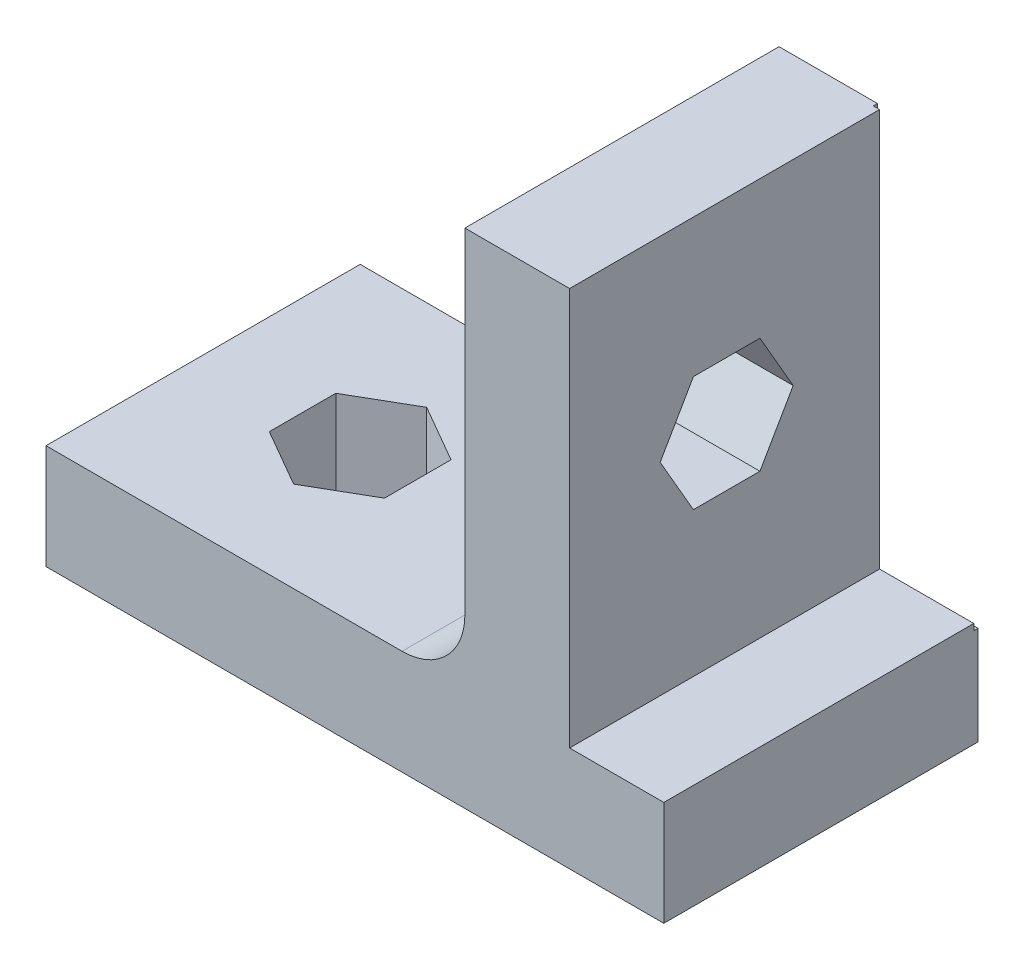
ISO-10303-21;
HEADER;
FILE_DESCRIPTION(('STEP AP214'),'2;1');
FILE_NAME('part.step','',(''),(''),'','','');
FILE_SCHEMA(('AUTOMOTIVE_DESIGN { 1 0 10303 214 1 1 1 1 }'));
ENDSEC;
DATA;
#1=APPLICATION_CONTEXT('core data for automotive mechanical design processes');
#2=APPLICATION_PROTOCOL_DEFINITION('international standard','automotive_design',2000,#1);
#3=PRODUCT_CONTEXT('',#1,'mechanical');
#4=PRODUCT('Part','Part','',(#3));
#5=PRODUCT_RELATED_PRODUCT_CATEGORY('part','',(#4));
#6=PRODUCT_DEFINITION_FORMATION('','',#4);
#7=PRODUCT_DEFINITION_CONTEXT('part definition',#1,'design');
#8=PRODUCT_DEFINITION('design','',#6,#7);
#9=PRODUCT_DEFINITION_SHAPE('','',#8);
#10=(LENGTH_UNIT() NAMED_UNIT(*) SI_UNIT(.MILLI.,.METRE.));
#11=(NAMED_UNIT(*) PLANE_ANGLE_UNIT() SI_UNIT($,.RADIAN.));
#12=(NAMED_UNIT(*) SI_UNIT($,.STERADIAN.) SOLID_ANGLE_UNIT());
#13=UNCERTAINTY_MEASURE_WITH_UNIT(LENGTH_MEASURE(1.E-05),#10,'distance_accuracy_value','');
#14=(GEOMETRIC_REPRESENTATION_CONTEXT(3) GLOBAL_UNCERTAINTY_ASSIGNED_CONTEXT((#13)) GLOBAL_UNIT_ASSIGNED_CONTEXT((#10,
#11,#12)) REPRESENTATION_CONTEXT('',''));
#15=CARTESIAN_POINT('',(0.,0.,0.));
#16=DIRECTION('',(0.,0.,1.));
#17=DIRECTION('',(1.,0.,0.));
#18=AXIS2_PLACEMENT_3D('',#15,#16,#17);
#19=CARTESIAN_POINT('',(29.5,0.,15.));
#20=DIRECTION('',(-1.,0.,0.));
#21=DIRECTION('',(0.,0.,1.));
#22=AXIS2_PLACEMENT_3D('',#19,#20,#21);
#23=PLANE('',#22);
#24=DIRECTION('',(0.,-1.,0.));
#25=VECTOR('',#24,1.);
#26=CARTESIAN_POINT('',(29.5,0.,0.2));
#27=LINE('',#26,#25);
#28=CARTESIAN_POINT('',(29.5,5.,0.2));
#29=VERTEX_POINT('',#28);
#30=CARTESIAN_POINT('',(29.5,4.7,0.2));
#31=VERTEX_POINT('',#30);
#32=EDGE_CURVE('E242',#29,#31,#27,.T.);
#33=ORIENTED_EDGE('',*,*,#32,.F.);
#34=DIRECTION('',(0.,0.,-1.));
#35=VECTOR('',#34,1.);
#36=CARTESIAN_POINT('',(29.5,5.,15.));
#37=LINE('',#36,#35);
#38=CARTESIAN_POINT('',(29.5,5.,15.));
#39=VERTEX_POINT('',#38);
#40=EDGE_CURVE('E428',#39,#29,#37,.T.);
#41=ORIENTED_EDGE('',*,*,#40,.F.);
#42=DIRECTION('',(0.,1.,0.));
#43=VECTOR('',#42,1.);
#44=CARTESIAN_POINT('',(29.5,0.,15.));
#45=LINE('',#44,#43);
#46=CARTESIAN_POINT('',(29.5,0.,15.));
#47=VERTEX_POINT('',#46);
#48=EDGE_CURVE('E376',#47,#39,#45,.T.);
#49=ORIENTED_EDGE('',*,*,#48,.F.);
#50=DIRECTION('',(0.,0.,-1.));
#51=VECTOR('',#50,1.);
#52=CARTESIAN_POINT('',(29.5,0.,15.));
#53=LINE('',#52,#51);
#54=CARTESIAN_POINT('',(29.5,0.,0.));
#55=VERTEX_POINT('',#54);
#56=EDGE_CURVE('E427',#47,#55,#53,.T.);
#57=ORIENTED_EDGE('',*,*,#56,.T.);
#58=DIRECTION('',(0.,1.,0.));
#59=VECTOR('',#58,1.);
#60=CARTESIAN_POINT('',(29.5,0.,0.));
#61=LINE('',#60,#59);
#62=CARTESIAN_POINT('',(29.5,4.7,0.));
#63=VERTEX_POINT('',#62);
#64=EDGE_CURVE('E402',#55,#63,#61,.T.);
#65=ORIENTED_EDGE('',*,*,#64,.T.);
#66=DIRECTION('',(0.,0.,-1.));
#67=VECTOR('',#66,1.);
#68=CARTESIAN_POINT('',(29.5,4.7,0.2));
#69=LINE('',#68,#67);
#70=EDGE_CURVE('E220',#31,#63,#69,.T.);
#71=ORIENTED_EDGE('',*,*,#70,.F.);
#72=EDGE_LOOP('',(#33,#41,#49,#57,#65,#71));
#73=FACE_BOUND('',#72,.T.);
#74=ADVANCED_FACE('F44',(#73),#23,.F.);
#75=CARTESIAN_POINT('',(29.5,5.,15.));
#76=DIRECTION('',(0.,-1.,0.));
#77=DIRECTION('',(0.,0.,-1.));
#78=AXIS2_PLACEMENT_3D('',#75,#76,#77);
#79=PLANE('',#78);
#80=DIRECTION('',(1.,0.,0.));
#81=VECTOR('',#80,1.);
#82=CARTESIAN_POINT('',(0.,5.,0.2));
#83=LINE('',#82,#81);
#84=CARTESIAN_POINT('',(25.,5.,0.2));
#85=VERTEX_POINT('',#84);
#86=EDGE_CURVE('E237',#85,#29,#83,.T.);
#87=ORIENTED_EDGE('',*,*,#86,.F.);
#88=DIRECTION('',(0.,0.,-1.));
#89=VECTOR('',#88,1.);
#90=CARTESIAN_POINT('',(25.,5.,15.));
#91=LINE('',#90,#89);
#92=CARTESIAN_POINT('',(25.,5.,15.));
#93=VERTEX_POINT('',#92);
#94=EDGE_CURVE('E422',#93,#85,#91,.T.);
#95=ORIENTED_EDGE('',*,*,#94,.F.);
#96=DIRECTION('',(-1.,0.,0.));
#97=VECTOR('',#96,1.);
#98=CARTESIAN_POINT('',(29.5,5.,15.));
#99=LINE('',#98,#97);
#100=EDGE_CURVE('E378',#39,#93,#99,.T.);
#101=ORIENTED_EDGE('',*,*,#100,.F.);
#102=ORIENTED_EDGE('',*,*,#40,.T.);
#103=EDGE_LOOP('',(#87,#95,#101,#102));
#104=FACE_BOUND('',#103,.T.);
#105=ADVANCED_FACE('F491',(#104),#79,.F.);
#106=CARTESIAN_POINT('',(25.,5.,15.));
#107=DIRECTION('',(-1.,0.,0.));
#108=DIRECTION('',(0.,-1.,0.));
#109=AXIS2_PLACEMENT_3D('',#106,#107,#108);
#110=PLANE('',#109);
#111=DIRECTION('',(0.,0.866025403784439,-0.5));
#112=VECTOR('',#111,1.);
#113=CARTESIAN_POINT('',(25.,11.9,5.91228675972853));
#114=LINE('',#113,#112);
#115=CARTESIAN_POINT('',(25.,11.9,5.91228675972853));
#116=VERTEX_POINT('',#115);
#117=CARTESIAN_POINT('',(25.,14.65,4.32457351945706));
#118=VERTEX_POINT('',#117);
#119=EDGE_CURVE('E264',#116,#118,#114,.T.);
#120=ORIENTED_EDGE('',*,*,#119,.F.);
#121=DIRECTION('',(0.,0.,-1.));
#122=VECTOR('',#121,1.);
#123=CARTESIAN_POINT('',(25.,11.9,9.08771324027147));
#124=LINE('',#123,#122);
#125=CARTESIAN_POINT('',(25.,11.9,9.08771324027147));
#126=VERTEX_POINT('',#125);
#127=EDGE_CURVE('E256',#126,#116,#124,.T.);
#128=ORIENTED_EDGE('',*,*,#127,.F.);
#129=DIRECTION('',(0.,-0.866025403784439,-0.5));
#130=VECTOR('',#129,1.);
#131=CARTESIAN_POINT('',(25.,14.65,10.6754264805429));
#132=LINE('',#131,#130);
#133=CARTESIAN_POINT('',(25.,14.65,10.6754264805429));
#134=VERTEX_POINT('',#133);
#135=EDGE_CURVE('E280',#134,#126,#132,.T.);
#136=ORIENTED_EDGE('',*,*,#135,.F.);
#137=DIRECTION('',(0.,-0.866025403784438,0.5));
#138=VECTOR('',#137,1.);
#139=CARTESIAN_POINT('',(25.,17.4,9.08771324027148));
#140=LINE('',#139,#138);
#141=CARTESIAN_POINT('',(25.,17.4,9.08771324027148));
#142=VERTEX_POINT('',#141);
#143=EDGE_CURVE('E274',#142,#134,#140,.T.);
#144=ORIENTED_EDGE('',*,*,#143,.F.);
#145=DIRECTION('',(0.,0.,1.));
#146=VECTOR('',#145,1.);
#147=CARTESIAN_POINT('',(25.,17.4,5.91228675972854));
#148=LINE('',#147,#146);
#149=CARTESIAN_POINT('',(25.,17.4,5.91228675972854));
#150=VERTEX_POINT('',#149);
#151=EDGE_CURVE('E266',#150,#142,#148,.T.);
#152=ORIENTED_EDGE('',*,*,#151,.F.);
#153=DIRECTION('',(0.,0.866025403784438,0.5));
#154=VECTOR('',#153,1.);
#155=CARTESIAN_POINT('',(25.,14.65,4.32457351945706));
#156=LINE('',#155,#154);
#157=EDGE_CURVE('E268',#118,#150,#156,.T.);
#158=ORIENTED_EDGE('',*,*,#157,.F.);
#159=EDGE_LOOP('',(#120,#128,#136,#144,#152,#158));
#160=FACE_BOUND('',#159,.T.);
#161=DIRECTION('',(0.,-1.,0.));
#162=VECTOR('',#161,1.);
#163=CARTESIAN_POINT('',(25.,0.,0.2));
#164=LINE('',#163,#162);
#165=CARTESIAN_POINT('',(25.,24.,0.200000000000001));
#166=VERTEX_POINT('',#165);
#167=EDGE_CURVE('E236',#166,#85,#164,.T.);
#168=ORIENTED_EDGE('',*,*,#167,.F.);
#169=DIRECTION('',(0.,0.,-1.));
#170=VECTOR('',#169,1.);
#171=CARTESIAN_POINT('',(25.,24.,15.));
#172=LINE('',#171,#170);
#173=CARTESIAN_POINT('',(25.,24.,15.));
#174=VERTEX_POINT('',#173);
#175=EDGE_CURVE('E234',#174,#166,#172,.T.);
#176=ORIENTED_EDGE('',*,*,#175,.F.);
#177=DIRECTION('',(0.,1.,0.));
#178=VECTOR('',#177,1.);
#179=CARTESIAN_POINT('',(25.,5.,15.));
#180=LINE('',#179,#178);
#181=EDGE_CURVE('E385',#93,#174,#180,.T.);
#182=ORIENTED_EDGE('',*,*,#181,.F.);
#183=ORIENTED_EDGE('',*,*,#94,.T.);
#184=EDGE_LOOP('',(#168,#176,#182,#183));
#185=FACE_BOUND('',#184,.T.);
#186=ADVANCED_FACE('F499',(#160,#185),#110,.F.);
#187=CARTESIAN_POINT('',(0.,5.,15.));
#188=DIRECTION('',(1.,0.,0.));
#189=DIRECTION('',(0.,1.,0.));
#190=AXIS2_PLACEMENT_3D('',#187,#188,#189);
#191=PLANE('',#190);
#192=DIRECTION('',(0.,-1.,0.));
#193=VECTOR('',#192,1.);
#194=CARTESIAN_POINT('',(0.,5.,0.));
#195=LINE('',#194,#193);
#196=CARTESIAN_POINT('',(0.,5.,0.));
#197=VERTEX_POINT('',#196);
#198=CARTESIAN_POINT('',(0.,0.,0.));
#199=VERTEX_POINT('',#198);
#200=EDGE_CURVE('E354',#197,#199,#195,.T.);
#201=ORIENTED_EDGE('',*,*,#200,.T.);
#202=DIRECTION('',(0.,0.,-1.));
#203=VECTOR('',#202,1.);
#204=CARTESIAN_POINT('',(0.,0.,15.));
#205=LINE('',#204,#203);
#206=CARTESIAN_POINT('',(0.,0.,15.));
#207=VERTEX_POINT('',#206);
#208=EDGE_CURVE('E432',#207,#199,#205,.T.);
#209=ORIENTED_EDGE('',*,*,#208,.F.);
#210=DIRECTION('',(0.,-1.,0.));
#211=VECTOR('',#210,1.);
#212=CARTESIAN_POINT('',(0.,5.,15.));
#213=LINE('',#212,#211);
#214=CARTESIAN_POINT('',(0.,5.,15.));
#215=VERTEX_POINT('',#214);
#216=EDGE_CURVE('E368',#215,#207,#213,.T.);
#217=ORIENTED_EDGE('',*,*,#216,.F.);
#218=DIRECTION('',(0.,0.,-1.));
#219=VECTOR('',#218,1.);
#220=CARTESIAN_POINT('',(0.,5.,15.));
#221=LINE('',#220,#219);
#222=EDGE_CURVE('E395',#215,#197,#221,.T.);
#223=ORIENTED_EDGE('',*,*,#222,.T.);
#224=EDGE_LOOP('',(#201,#209,#217,#223));
#225=FACE_BOUND('',#224,.T.);
#226=ADVANCED_FACE('F476',(#225),#191,.F.);
#227=CARTESIAN_POINT('',(0.,0.,15.));
#228=DIRECTION('',(0.,1.,0.));
#229=DIRECTION('',(0.,0.,1.));
#230=AXIS2_PLACEMENT_3D('',#227,#228,#229);
#231=PLANE('',#230);
#232=DIRECTION('',(0.866025403784439,0.,-0.5));
#233=VECTOR('',#232,1.);
#234=CARTESIAN_POINT('',(7.5,0.,10.6754264805429));
#235=LINE('',#234,#233);
#236=CARTESIAN_POINT('',(7.5,0.,10.6754264805429));
#237=VERTEX_POINT('',#236);
#238=CARTESIAN_POINT('',(10.25,0.,9.08771324027147));
#239=VERTEX_POINT('',#238);
#240=EDGE_CURVE('E325',#237,#239,#235,.T.);
#241=ORIENTED_EDGE('',*,*,#240,.T.);
#242=DIRECTION('',(0.,0.,-1.));
#243=VECTOR('',#242,1.);
#244=CARTESIAN_POINT('',(10.25,0.,9.08771324027147));
#245=LINE('',#244,#243);
#246=CARTESIAN_POINT('',(10.25,0.,5.91228675972853));
#247=VERTEX_POINT('',#246);
#248=EDGE_CURVE('E305',#239,#247,#245,.T.);
#249=ORIENTED_EDGE('',*,*,#248,.T.);
#250=DIRECTION('',(-0.866025403784439,0.,-0.5));
#251=VECTOR('',#250,1.);
#252=CARTESIAN_POINT('',(10.25,0.,5.91228675972853));
#253=LINE('',#252,#251);
#254=CARTESIAN_POINT('',(7.5,0.,4.32457351945706));
#255=VERTEX_POINT('',#254);
#256=EDGE_CURVE('E306',#247,#255,#253,.T.);
#257=ORIENTED_EDGE('',*,*,#256,.T.);
#258=DIRECTION('',(-0.866025403784439,0.,0.5));
#259=VECTOR('',#258,1.);
#260=CARTESIAN_POINT('',(7.5,0.,4.32457351945706));
#261=LINE('',#260,#259);
#262=CARTESIAN_POINT('',(4.75,0.,5.91228675972853));
#263=VERTEX_POINT('',#262);
#264=EDGE_CURVE('E311',#255,#263,#261,.T.);
#265=ORIENTED_EDGE('',*,*,#264,.T.);
#266=DIRECTION('',(0.,0.,1.));
#267=VECTOR('',#266,1.);
#268=CARTESIAN_POINT('',(4.75,0.,5.91228675972853));
#269=LINE('',#268,#267);
#270=CARTESIAN_POINT('',(4.75,0.,9.08771324027147));
#271=VERTEX_POINT('',#270);
#272=EDGE_CURVE('E314',#263,#271,#269,.T.);
#273=ORIENTED_EDGE('',*,*,#272,.T.);
#274=DIRECTION('',(0.866025403784438,0.,0.5));
#275=VECTOR('',#274,1.);
#276=CARTESIAN_POINT('',(4.75,0.,9.08771324027147));
#277=LINE('',#276,#275);
#278=EDGE_CURVE('E316',#271,#237,#277,.T.);
#279=ORIENTED_EDGE('',*,*,#278,.T.);
#280=EDGE_LOOP('',(#241,#249,#257,#265,#273,#279));
#281=FACE_BOUND('',#280,.T.);
#282=DIRECTION('',(1.,0.,0.));
#283=VECTOR('',#282,1.);
#284=CARTESIAN_POINT('',(0.,0.,0.));
#285=LINE('',#284,#283);
#286=EDGE_CURVE('E397',#199,#55,#285,.T.);
#287=ORIENTED_EDGE('',*,*,#286,.T.);
#288=ORIENTED_EDGE('',*,*,#56,.F.);
#289=DIRECTION('',(1.,0.,0.));
#290=VECTOR('',#289,1.);
#291=CARTESIAN_POINT('',(0.,0.,15.));
#292=LINE('',#291,#290);
#293=EDGE_CURVE('E375',#207,#47,#292,.T.);
#294=ORIENTED_EDGE('',*,*,#293,.F.);
#295=ORIENTED_EDGE('',*,*,#208,.T.);
#296=EDGE_LOOP('',(#287,#288,#294,#295));
#297=FACE_BOUND('',#296,.T.);
#298=ADVANCED_FACE('F506',(#281,#297),#231,.F.);
#299=CARTESIAN_POINT('',(25.,24.,15.));
#300=DIRECTION('',(0.,-1.,0.));
#301=DIRECTION('',(0.,0.,-1.));
#302=AXIS2_PLACEMENT_3D('',#299,#300,#301);
#303=PLANE('',#302);
#304=DIRECTION('',(1.,0.,0.));
#305=VECTOR('',#304,1.);
#306=CARTESIAN_POINT('',(0.,24.,0.2));
#307=LINE('',#306,#305);
#308=CARTESIAN_POINT('',(24.7,24.,0.2));
#309=VERTEX_POINT('',#308);
#310=EDGE_CURVE('E225',#309,#166,#307,.T.);
#311=ORIENTED_EDGE('',*,*,#310,.F.);
#312=DIRECTION('',(0.,0.,-1.));
#313=VECTOR('',#312,1.);
#314=CARTESIAN_POINT('',(24.7,24.,0.2));
#315=LINE('',#314,#313);
#316=CARTESIAN_POINT('',(24.7,24.,0.));
#317=VERTEX_POINT('',#316);
#318=EDGE_CURVE('E210',#309,#317,#315,.T.);
#319=ORIENTED_EDGE('',*,*,#318,.T.);
#320=DIRECTION('',(-1.,0.,0.));
#321=VECTOR('',#320,1.);
#322=CARTESIAN_POINT('',(25.,24.,0.));
#323=LINE('',#322,#321);
#324=CARTESIAN_POINT('',(20.,24.,0.));
#325=VERTEX_POINT('',#324);
#326=EDGE_CURVE('E403',#317,#325,#323,.T.);
#327=ORIENTED_EDGE('',*,*,#326,.T.);
#328=DIRECTION('',(0.,0.,-1.));
#329=VECTOR('',#328,1.);
#330=CARTESIAN_POINT('',(20.,24.,15.));
#331=LINE('',#330,#329);
#332=CARTESIAN_POINT('',(20.,24.,15.));
#333=VERTEX_POINT('',#332);
#334=EDGE_CURVE('E418',#333,#325,#331,.T.);
#335=ORIENTED_EDGE('',*,*,#334,.F.);
#336=DIRECTION('',(-1.,0.,0.));
#337=VECTOR('',#336,1.);
#338=CARTESIAN_POINT('',(25.,24.,15.));
#339=LINE('',#338,#337);
#340=EDGE_CURVE('E383',#174,#333,#339,.T.);
#341=ORIENTED_EDGE('',*,*,#340,.F.);
#342=ORIENTED_EDGE('',*,*,#175,.T.);
#343=EDGE_LOOP('',(#311,#319,#327,#335,#341,#342));
#344=FACE_BOUND('',#343,.T.);
#345=ADVANCED_FACE('F233',(#344),#303,.F.);
#346=CARTESIAN_POINT('',(20.,24.,15.));
#347=DIRECTION('',(1.,0.,0.));
#348=DIRECTION('',(0.,1.,0.));
#349=AXIS2_PLACEMENT_3D('',#346,#347,#348);
#350=PLANE('',#349);
#351=DIRECTION('',(0.,-0.866025403784439,-0.5));
#352=VECTOR('',#351,1.);
#353=CARTESIAN_POINT('',(20.,23.5350952641916,15.8052386230995));
#354=LINE('',#353,#352);
#355=CARTESIAN_POINT('',(20.,14.65,10.6754264805429));
#356=VERTEX_POINT('',#355);
#357=CARTESIAN_POINT('',(20.,11.9,9.08771324027147));
#358=VERTEX_POINT('',#357);
#359=EDGE_CURVE('E453',#356,#358,#354,.T.);
#360=ORIENTED_EDGE('',*,*,#359,.T.);
#361=DIRECTION('',(0.,0.,-1.));
#362=VECTOR('',#361,1.);
#363=CARTESIAN_POINT('',(20.,11.9,15.));
#364=LINE('',#363,#362);
#365=CARTESIAN_POINT('',(20.,11.9,5.91228675972853));
#366=VERTEX_POINT('',#365);
#367=EDGE_CURVE('E457',#358,#366,#364,.T.);
#368=ORIENTED_EDGE('',*,*,#367,.T.);
#369=DIRECTION('',(0.,0.866025403784439,-0.5));
#370=VECTOR('',#369,1.);
#371=CARTESIAN_POINT('',(20.,17.0399047358084,2.94476137690054));
#372=LINE('',#371,#370);
#373=CARTESIAN_POINT('',(20.,14.65,4.32457351945706));
#374=VERTEX_POINT('',#373);
#375=EDGE_CURVE('E438',#366,#374,#372,.T.);
#376=ORIENTED_EDGE('',*,*,#375,.T.);
#377=DIRECTION('',(0.,0.866025403784439,0.5));
#378=VECTOR('',#377,1.);
#379=CARTESIAN_POINT('',(20.,26.2850952641916,11.042098902285));
#380=LINE('',#379,#378);
#381=CARTESIAN_POINT('',(20.,17.4,5.91228675972854));
#382=VERTEX_POINT('',#381);
#383=EDGE_CURVE('E445',#374,#382,#380,.T.);
#384=ORIENTED_EDGE('',*,*,#383,.T.);
#385=DIRECTION('',(0.,0.,1.));
#386=VECTOR('',#385,1.);
#387=CARTESIAN_POINT('',(20.,17.4,15.));
#388=LINE('',#387,#386);
#389=CARTESIAN_POINT('',(20.,17.4,9.08771324027148));
#390=VERTEX_POINT('',#389);
#391=EDGE_CURVE('E447',#382,#390,#388,.T.);
#392=ORIENTED_EDGE('',*,*,#391,.T.);
#393=DIRECTION('',(0.,-0.866025403784439,0.5));
#394=VECTOR('',#393,1.);
#395=CARTESIAN_POINT('',(20.,19.7899047358084,7.70790109771496));
#396=LINE('',#395,#394);
#397=EDGE_CURVE('E448',#390,#356,#396,.T.);
#398=ORIENTED_EDGE('',*,*,#397,.T.);
#399=EDGE_LOOP('',(#360,#368,#376,#384,#392,#398));
#400=FACE_BOUND('',#399,.T.);
#401=DIRECTION('',(0.,-1.,0.));
#402=VECTOR('',#401,1.);
#403=CARTESIAN_POINT('',(20.,24.,0.));
#404=LINE('',#403,#402);
#405=CARTESIAN_POINT('',(20.,8.,0.));
#406=VERTEX_POINT('',#405);
#407=EDGE_CURVE('E410',#325,#406,#404,.T.);
#408=ORIENTED_EDGE('',*,*,#407,.T.);
#409=DIRECTION('',(0.,0.,-1.));
#410=VECTOR('',#409,1.);
#411=CARTESIAN_POINT('',(20.,8.,15.));
#412=LINE('',#411,#410);
#413=CARTESIAN_POINT('',(20.,8.,15.));
#414=VERTEX_POINT('',#413);
#415=EDGE_CURVE('E64',#406,#414,#412,.F.);
#416=ORIENTED_EDGE('',*,*,#415,.T.);
#417=DIRECTION('',(0.,-1.,0.));
#418=VECTOR('',#417,1.);
#419=CARTESIAN_POINT('',(20.,24.,15.));
#420=LINE('',#419,#418);
#421=EDGE_CURVE('E390',#333,#414,#420,.T.);
#422=ORIENTED_EDGE('',*,*,#421,.F.);
#423=ORIENTED_EDGE('',*,*,#334,.T.);
#424=EDGE_LOOP('',(#408,#416,#422,#423));
#425=FACE_BOUND('',#424,.T.);
#426=ADVANCED_FACE('F523',(#400,#425),#350,.F.);
#427=CARTESIAN_POINT('',(20.,5.,15.));
#428=DIRECTION('',(0.,-1.,0.));
#429=DIRECTION('',(1.,0.,0.));
#430=AXIS2_PLACEMENT_3D('',#427,#428,#429);
#431=PLANE('',#430);
#432=DIRECTION('',(-0.866025403784439,0.,-0.5));
#433=VECTOR('',#432,1.);
#434=CARTESIAN_POINT('',(10.25,5.,5.91228675972853));
#435=LINE('',#434,#433);
#436=CARTESIAN_POINT('',(10.25,5.,5.91228675972853));
#437=VERTEX_POINT('',#436);
#438=CARTESIAN_POINT('',(7.5,5.,4.32457351945706));
#439=VERTEX_POINT('',#438);
#440=EDGE_CURVE('E326',#437,#439,#435,.T.);
#441=ORIENTED_EDGE('',*,*,#440,.F.);
#442=DIRECTION('',(0.,0.,-1.));
#443=VECTOR('',#442,1.);
#444=CARTESIAN_POINT('',(10.25,5.,9.08771324027147));
#445=LINE('',#444,#443);
#446=CARTESIAN_POINT('',(10.25,5.,9.08771324027147));
#447=VERTEX_POINT('',#446);
#448=EDGE_CURVE('E288',#447,#437,#445,.T.);
#449=ORIENTED_EDGE('',*,*,#448,.F.);
#450=DIRECTION('',(0.866025403784439,0.,-0.5));
#451=VECTOR('',#450,1.);
#452=CARTESIAN_POINT('',(7.5,5.,10.6754264805429));
#453=LINE('',#452,#451);
#454=CARTESIAN_POINT('',(7.5,5.,10.6754264805429));
#455=VERTEX_POINT('',#454);
#456=EDGE_CURVE('E310',#455,#447,#453,.T.);
#457=ORIENTED_EDGE('',*,*,#456,.F.);
#458=DIRECTION('',(0.866025403784438,0.,0.5));
#459=VECTOR('',#458,1.);
#460=CARTESIAN_POINT('',(4.75,5.,9.08771324027147));
#461=LINE('',#460,#459);
#462=CARTESIAN_POINT('',(4.75,5.,9.08771324027147));
#463=VERTEX_POINT('',#462);
#464=EDGE_CURVE('E341',#463,#455,#461,.T.);
#465=ORIENTED_EDGE('',*,*,#464,.F.);
#466=DIRECTION('',(0.,0.,1.));
#467=VECTOR('',#466,1.);
#468=CARTESIAN_POINT('',(4.75,5.,5.91228675972853));
#469=LINE('',#468,#467);
#470=CARTESIAN_POINT('',(4.75,5.,5.91228675972853));
#471=VERTEX_POINT('',#470);
#472=EDGE_CURVE('E336',#471,#463,#469,.T.);
#473=ORIENTED_EDGE('',*,*,#472,.F.);
#474=DIRECTION('',(-0.866025403784439,0.,0.5));
#475=VECTOR('',#474,1.);
#476=CARTESIAN_POINT('',(7.5,5.,4.32457351945706));
#477=LINE('',#476,#475);
#478=EDGE_CURVE('E335',#439,#471,#477,.T.);
#479=ORIENTED_EDGE('',*,*,#478,.F.);
#480=EDGE_LOOP('',(#441,#449,#457,#465,#473,#479));
#481=FACE_BOUND('',#480,.T.);
#482=DIRECTION('',(-1.,0.,0.));
#483=VECTOR('',#482,1.);
#484=CARTESIAN_POINT('',(20.,5.,15.));
#485=LINE('',#484,#483);
#486=CARTESIAN_POINT('',(17.,5.,15.));
#487=VERTEX_POINT('',#486);
#488=EDGE_CURVE('E393',#487,#215,#485,.T.);
#489=ORIENTED_EDGE('',*,*,#488,.F.);
#490=DIRECTION('',(0.,0.,-1.));
#491=VECTOR('',#490,1.);
#492=CARTESIAN_POINT('',(17.,5.,0.));
#493=LINE('',#492,#491);
#494=CARTESIAN_POINT('',(17.,5.,0.));
#495=VERTEX_POINT('',#494);
#496=EDGE_CURVE('E464',#487,#495,#493,.T.);
#497=ORIENTED_EDGE('',*,*,#496,.T.);
#498=DIRECTION('',(-1.,0.,0.));
#499=VECTOR('',#498,1.);
#500=CARTESIAN_POINT('',(20.,5.,0.));
#501=LINE('',#500,#499);
#502=EDGE_CURVE('E373',#495,#197,#501,.T.);
#503=ORIENTED_EDGE('',*,*,#502,.T.);
#504=ORIENTED_EDGE('',*,*,#222,.F.);
#505=EDGE_LOOP('',(#489,#497,#503,#504));
#506=FACE_BOUND('',#505,.T.);
#507=ADVANCED_FACE('F474',(#481,#506),#431,.F.);
#508=CARTESIAN_POINT('',(0.,0.,15.));
#509=DIRECTION('',(0.,0.,1.));
#510=DIRECTION('',(1.,0.,0.));
#511=AXIS2_PLACEMENT_3D('',#508,#509,#510);
#512=PLANE('',#511);
#513=ORIENTED_EDGE('',*,*,#216,.T.);
#514=ORIENTED_EDGE('',*,*,#293,.T.);
#515=ORIENTED_EDGE('',*,*,#48,.T.);
#516=ORIENTED_EDGE('',*,*,#100,.T.);
#517=ORIENTED_EDGE('',*,*,#181,.T.);
#518=ORIENTED_EDGE('',*,*,#340,.T.);
#519=ORIENTED_EDGE('',*,*,#421,.T.);
#520=CARTESIAN_POINT('',(17.,8.,15.));
#521=DIRECTION('',(0.,0.,1.));
#522=DIRECTION('',(1.,0.,0.));
#523=AXIS2_PLACEMENT_3D('',#520,#521,#522);
#524=CIRCLE('',#523,3.);
#525=EDGE_CURVE('E11',#414,#487,#524,.F.);
#526=ORIENTED_EDGE('',*,*,#525,.T.);
#527=ORIENTED_EDGE('',*,*,#488,.T.);
#528=EDGE_LOOP('',(#513,#514,#515,#516,#517,#518,#519,#526,#527));
#529=FACE_BOUND('',#528,.T.);
#530=ADVANCED_FACE('F482',(#529),#512,.T.);
#531=CARTESIAN_POINT('',(0.,0.,0.));
#532=DIRECTION('',(0.,0.,1.));
#533=DIRECTION('',(1.,0.,0.));
#534=AXIS2_PLACEMENT_3D('',#531,#532,#533);
#535=PLANE('',#534);
#536=ORIENTED_EDGE('',*,*,#326,.F.);
#537=DIRECTION('',(0.,-1.,0.));
#538=VECTOR('',#537,1.);
#539=CARTESIAN_POINT('',(24.7,0.,0.));
#540=LINE('',#539,#538);
#541=CARTESIAN_POINT('',(24.7,4.7,0.));
#542=VERTEX_POINT('',#541);
#543=EDGE_CURVE('E213',#317,#542,#540,.T.);
#544=ORIENTED_EDGE('',*,*,#543,.T.);
#545=DIRECTION('',(1.,0.,0.));
#546=VECTOR('',#545,1.);
#547=CARTESIAN_POINT('',(0.,4.7,0.));
#548=LINE('',#547,#546);
#549=EDGE_CURVE('E226',#542,#63,#548,.T.);
#550=ORIENTED_EDGE('',*,*,#549,.T.);
#551=ORIENTED_EDGE('',*,*,#64,.F.);
#552=ORIENTED_EDGE('',*,*,#286,.F.);
#553=ORIENTED_EDGE('',*,*,#200,.F.);
#554=ORIENTED_EDGE('',*,*,#502,.F.);
#555=CARTESIAN_POINT('',(17.,8.,0.));
#556=DIRECTION('',(0.,0.,1.));
#557=DIRECTION('',(1.,0.,0.));
#558=AXIS2_PLACEMENT_3D('',#555,#556,#557);
#559=CIRCLE('',#558,3.);
#560=EDGE_CURVE('E53',#495,#406,#559,.T.);
#561=ORIENTED_EDGE('',*,*,#560,.T.);
#562=ORIENTED_EDGE('',*,*,#407,.F.);
#563=EDGE_LOOP('',(#536,#544,#550,#551,#552,#553,#554,#561,#562));
#564=FACE_BOUND('',#563,.T.);
#565=ADVANCED_FACE('F478',(#564),#535,.F.);
#566=CARTESIAN_POINT('',(10.25,0.,9.08771324027147));
#567=DIRECTION('',(1.,0.,0.));
#568=DIRECTION('',(0.,1.,0.));
#569=AXIS2_PLACEMENT_3D('',#566,#567,#568);
#570=PLANE('',#569);
#571=ORIENTED_EDGE('',*,*,#448,.T.);
#572=DIRECTION('',(0.,1.,0.));
#573=VECTOR('',#572,1.);
#574=CARTESIAN_POINT('',(10.25,0.,5.91228675972853));
#575=LINE('',#574,#573);
#576=EDGE_CURVE('E329',#247,#437,#575,.T.);
#577=ORIENTED_EDGE('',*,*,#576,.F.);
#578=ORIENTED_EDGE('',*,*,#248,.F.);
#579=DIRECTION('',(0.,1.,0.));
#580=VECTOR('',#579,1.);
#581=CARTESIAN_POINT('',(10.25,0.,9.08771324027147));
#582=LINE('',#581,#580);
#583=EDGE_CURVE('E350',#239,#447,#582,.T.);
#584=ORIENTED_EDGE('',*,*,#583,.T.);
#585=EDGE_LOOP('',(#571,#577,#578,#584));
#586=FACE_BOUND('',#585,.T.);
#587=ADVANCED_FACE('F530',(#586),#570,.F.);
#588=CARTESIAN_POINT('',(7.5,0.,10.6754264805429));
#589=DIRECTION('',(0.5,0.,0.866025403784439));
#590=DIRECTION('',(0.866025403784439,0.,-0.5));
#591=AXIS2_PLACEMENT_3D('',#588,#589,#590);
#592=PLANE('',#591);
#593=ORIENTED_EDGE('',*,*,#456,.T.);
#594=ORIENTED_EDGE('',*,*,#583,.F.);
#595=ORIENTED_EDGE('',*,*,#240,.F.);
#596=DIRECTION('',(0.,1.,0.));
#597=VECTOR('',#596,1.);
#598=CARTESIAN_POINT('',(7.5,0.,10.6754264805429));
#599=LINE('',#598,#597);
#600=EDGE_CURVE('E352',#237,#455,#599,.T.);
#601=ORIENTED_EDGE('',*,*,#600,.T.);
#602=EDGE_LOOP('',(#593,#594,#595,#601));
#603=FACE_BOUND('',#602,.T.);
#604=ADVANCED_FACE('F534',(#603),#592,.F.);
#605=CARTESIAN_POINT('',(4.75,0.,9.08771324027147));
#606=DIRECTION('',(-0.5,0.,0.866025403784438));
#607=DIRECTION('',(0.866025403784438,0.,0.5));
#608=AXIS2_PLACEMENT_3D('',#605,#606,#607);
#609=PLANE('',#608);
#610=ORIENTED_EDGE('',*,*,#464,.T.);
#611=ORIENTED_EDGE('',*,*,#600,.F.);
#612=ORIENTED_EDGE('',*,*,#278,.F.);
#613=DIRECTION('',(0.,1.,0.));
#614=VECTOR('',#613,1.);
#615=CARTESIAN_POINT('',(4.75,0.,9.08771324027147));
#616=LINE('',#615,#614);
#617=EDGE_CURVE('E358',#271,#463,#616,.T.);
#618=ORIENTED_EDGE('',*,*,#617,.T.);
#619=EDGE_LOOP('',(#610,#611,#612,#618));
#620=FACE_BOUND('',#619,.T.);
#621=ADVANCED_FACE('F547',(#620),#609,.F.);
#622=CARTESIAN_POINT('',(4.75,0.,5.91228675972853));
#623=DIRECTION('',(-1.,0.,0.));
#624=DIRECTION('',(0.,-1.,0.));
#625=AXIS2_PLACEMENT_3D('',#622,#623,#624);
#626=PLANE('',#625);
#627=ORIENTED_EDGE('',*,*,#472,.T.);
#628=ORIENTED_EDGE('',*,*,#617,.F.);
#629=ORIENTED_EDGE('',*,*,#272,.F.);
#630=DIRECTION('',(0.,1.,0.));
#631=VECTOR('',#630,1.);
#632=CARTESIAN_POINT('',(4.75,0.,5.91228675972853));
#633=LINE('',#632,#631);
#634=EDGE_CURVE('E360',#263,#471,#633,.T.);
#635=ORIENTED_EDGE('',*,*,#634,.T.);
#636=EDGE_LOOP('',(#627,#628,#629,#635));
#637=FACE_BOUND('',#636,.T.);
#638=ADVANCED_FACE('F545',(#637),#626,.F.);
#639=CARTESIAN_POINT('',(7.5,0.,4.32457351945706));
#640=DIRECTION('',(-0.5,0.,-0.866025403784439));
#641=DIRECTION('',(-0.866025403784439,0.,0.5));
#642=AXIS2_PLACEMENT_3D('',#639,#640,#641);
#643=PLANE('',#642);
#644=ORIENTED_EDGE('',*,*,#478,.T.);
#645=ORIENTED_EDGE('',*,*,#634,.F.);
#646=ORIENTED_EDGE('',*,*,#264,.F.);
#647=DIRECTION('',(0.,1.,0.));
#648=VECTOR('',#647,1.);
#649=CARTESIAN_POINT('',(7.5,0.,4.32457351945706));
#650=LINE('',#649,#648);
#651=EDGE_CURVE('E365',#255,#439,#650,.T.);
#652=ORIENTED_EDGE('',*,*,#651,.T.);
#653=EDGE_LOOP('',(#644,#645,#646,#652));
#654=FACE_BOUND('',#653,.T.);
#655=ADVANCED_FACE('F537',(#654),#643,.F.);
#656=CARTESIAN_POINT('',(10.25,0.,5.91228675972853));
#657=DIRECTION('',(0.5,0.,-0.866025403784439));
#658=DIRECTION('',(-0.866025403784439,0.,-0.5));
#659=AXIS2_PLACEMENT_3D('',#656,#657,#658);
#660=PLANE('',#659);
#661=ORIENTED_EDGE('',*,*,#440,.T.);
#662=ORIENTED_EDGE('',*,*,#651,.F.);
#663=ORIENTED_EDGE('',*,*,#256,.F.);
#664=ORIENTED_EDGE('',*,*,#576,.T.);
#665=EDGE_LOOP('',(#661,#662,#663,#664));
#666=FACE_BOUND('',#665,.T.);
#667=ADVANCED_FACE('F539',(#666),#660,.F.);
#668=CARTESIAN_POINT('',(0.,11.9,9.08771324027147));
#669=DIRECTION('',(0.,-1.,0.));
#670=DIRECTION('',(1.,0.,0.));
#671=AXIS2_PLACEMENT_3D('',#668,#669,#670);
#672=PLANE('',#671);
#673=DIRECTION('',(1.,0.,0.));
#674=VECTOR('',#673,1.);
#675=CARTESIAN_POINT('',(0.,11.9,9.08771324027147));
#676=LINE('',#675,#674);
#677=EDGE_CURVE('E282',#358,#126,#676,.T.);
#678=ORIENTED_EDGE('',*,*,#677,.T.);
#679=ORIENTED_EDGE('',*,*,#127,.T.);
#680=DIRECTION('',(1.,0.,0.));
#681=VECTOR('',#680,1.);
#682=CARTESIAN_POINT('',(0.,11.9,5.91228675972853));
#683=LINE('',#682,#681);
#684=EDGE_CURVE('E284',#366,#116,#683,.T.);
#685=ORIENTED_EDGE('',*,*,#684,.F.);
#686=ORIENTED_EDGE('',*,*,#367,.F.);
#687=EDGE_LOOP('',(#678,#679,#685,#686));
#688=FACE_BOUND('',#687,.T.);
#689=ADVANCED_FACE('F538',(#688),#672,.F.);
#690=CARTESIAN_POINT('',(0.,14.65,10.6754264805429));
#691=DIRECTION('',(0.,-0.5,0.866025403784439));
#692=DIRECTION('',(0.,-0.866025403784439,-0.5));
#693=AXIS2_PLACEMENT_3D('',#690,#691,#692);
#694=PLANE('',#693);
#695=DIRECTION('',(1.,0.,0.));
#696=VECTOR('',#695,1.);
#697=CARTESIAN_POINT('',(0.,14.65,10.6754264805429));
#698=LINE('',#697,#696);
#699=EDGE_CURVE('E289',#356,#134,#698,.T.);
#700=ORIENTED_EDGE('',*,*,#699,.T.);
#701=ORIENTED_EDGE('',*,*,#135,.T.);
#702=ORIENTED_EDGE('',*,*,#677,.F.);
#703=ORIENTED_EDGE('',*,*,#359,.F.);
#704=EDGE_LOOP('',(#700,#701,#702,#703));
#705=FACE_BOUND('',#704,.T.);
#706=ADVANCED_FACE('F556',(#705),#694,.F.);
#707=CARTESIAN_POINT('',(0.,17.4,9.08771324027148));
#708=DIRECTION('',(0.,0.5,0.866025403784439));
#709=DIRECTION('',(0.,-0.866025403784439,0.5));
#710=AXIS2_PLACEMENT_3D('',#707,#708,#709);
#711=PLANE('',#710);
#712=DIRECTION('',(1.,0.,0.));
#713=VECTOR('',#712,1.);
#714=CARTESIAN_POINT('',(0.,17.4,9.08771324027148));
#715=LINE('',#714,#713);
#716=EDGE_CURVE('E286',#390,#142,#715,.T.);
#717=ORIENTED_EDGE('',*,*,#716,.T.);
#718=ORIENTED_EDGE('',*,*,#143,.T.);
#719=ORIENTED_EDGE('',*,*,#699,.F.);
#720=ORIENTED_EDGE('',*,*,#397,.F.);
#721=EDGE_LOOP('',(#717,#718,#719,#720));
#722=FACE_BOUND('',#721,.T.);
#723=ADVANCED_FACE('F569',(#722),#711,.F.);
#724=CARTESIAN_POINT('',(0.,17.4,5.91228675972854));
#725=DIRECTION('',(0.,1.,0.));
#726=DIRECTION('',(-1.,0.,0.));
#727=AXIS2_PLACEMENT_3D('',#724,#725,#726);
#728=PLANE('',#727);
#729=DIRECTION('',(1.,0.,0.));
#730=VECTOR('',#729,1.);
#731=CARTESIAN_POINT('',(0.,17.4,5.91228675972854));
#732=LINE('',#731,#730);
#733=EDGE_CURVE('E291',#382,#150,#732,.T.);
#734=ORIENTED_EDGE('',*,*,#733,.T.);
#735=ORIENTED_EDGE('',*,*,#151,.T.);
#736=ORIENTED_EDGE('',*,*,#716,.F.);
#737=ORIENTED_EDGE('',*,*,#391,.F.);
#738=EDGE_LOOP('',(#734,#735,#736,#737));
#739=FACE_BOUND('',#738,.T.);
#740=ADVANCED_FACE('F566',(#739),#728,.F.);
#741=CARTESIAN_POINT('',(0.,14.65,4.32457351945706));
#742=DIRECTION('',(0.,0.5,-0.866025403784439));
#743=DIRECTION('',(0.,0.866025403784439,0.5));
#744=AXIS2_PLACEMENT_3D('',#741,#742,#743);
#745=PLANE('',#744);
#746=DIRECTION('',(1.,0.,0.));
#747=VECTOR('',#746,1.);
#748=CARTESIAN_POINT('',(0.,14.65,4.32457351945706));
#749=LINE('',#748,#747);
#750=EDGE_CURVE('E298',#374,#118,#749,.T.);
#751=ORIENTED_EDGE('',*,*,#750,.T.);
#752=ORIENTED_EDGE('',*,*,#157,.T.);
#753=ORIENTED_EDGE('',*,*,#733,.F.);
#754=ORIENTED_EDGE('',*,*,#383,.F.);
#755=EDGE_LOOP('',(#751,#752,#753,#754));
#756=FACE_BOUND('',#755,.T.);
#757=ADVANCED_FACE('F565',(#756),#745,.F.);
#758=CARTESIAN_POINT('',(0.,11.9,5.91228675972853));
#759=DIRECTION('',(0.,-0.5,-0.866025403784439));
#760=DIRECTION('',(0.,0.866025403784439,-0.5));
#761=AXIS2_PLACEMENT_3D('',#758,#759,#760);
#762=PLANE('',#761);
#763=ORIENTED_EDGE('',*,*,#684,.T.);
#764=ORIENTED_EDGE('',*,*,#119,.T.);
#765=ORIENTED_EDGE('',*,*,#750,.F.);
#766=ORIENTED_EDGE('',*,*,#375,.F.);
#767=EDGE_LOOP('',(#763,#764,#765,#766));
#768=FACE_BOUND('',#767,.T.);
#769=ADVANCED_FACE('F557',(#768),#762,.F.);
#770=CARTESIAN_POINT('',(24.7,0.,0.2));
#771=DIRECTION('',(1.,0.,0.));
#772=DIRECTION('',(0.,1.,0.));
#773=AXIS2_PLACEMENT_3D('',#770,#771,#772);
#774=PLANE('',#773);
#775=ORIENTED_EDGE('',*,*,#543,.F.);
#776=ORIENTED_EDGE('',*,*,#318,.F.);
#777=DIRECTION('',(0.,-1.,0.));
#778=VECTOR('',#777,1.);
#779=CARTESIAN_POINT('',(24.7,0.,0.2));
#780=LINE('',#779,#778);
#781=CARTESIAN_POINT('',(24.7,4.7,0.2));
#782=VERTEX_POINT('',#781);
#783=EDGE_CURVE('E214',#309,#782,#780,.T.);
#784=ORIENTED_EDGE('',*,*,#783,.T.);
#785=DIRECTION('',(0.,0.,-1.));
#786=VECTOR('',#785,1.);
#787=CARTESIAN_POINT('',(24.7,4.7,0.2));
#788=LINE('',#787,#786);
#789=EDGE_CURVE('E251',#782,#542,#788,.T.);
#790=ORIENTED_EDGE('',*,*,#789,.T.);
#791=EDGE_LOOP('',(#775,#776,#784,#790));
#792=FACE_BOUND('',#791,.T.);
#793=ADVANCED_FACE('F209',(#792),#774,.T.);
#794=CARTESIAN_POINT('',(0.,4.7,0.2));
#795=DIRECTION('',(0.,1.,0.));
#796=DIRECTION('',(-1.,0.,0.));
#797=AXIS2_PLACEMENT_3D('',#794,#795,#796);
#798=PLANE('',#797);
#799=ORIENTED_EDGE('',*,*,#549,.F.);
#800=ORIENTED_EDGE('',*,*,#789,.F.);
#801=DIRECTION('',(1.,0.,0.));
#802=VECTOR('',#801,1.);
#803=CARTESIAN_POINT('',(0.,4.7,0.2));
#804=LINE('',#803,#802);
#805=EDGE_CURVE('E216',#782,#31,#804,.T.);
#806=ORIENTED_EDGE('',*,*,#805,.T.);
#807=ORIENTED_EDGE('',*,*,#70,.T.);
#808=EDGE_LOOP('',(#799,#800,#806,#807));
#809=FACE_BOUND('',#808,.T.);
#810=ADVANCED_FACE('F489',(#809),#798,.T.);
#811=CARTESIAN_POINT('',(0.,0.,0.2));
#812=DIRECTION('',(0.,0.,-1.));
#813=DIRECTION('',(-1.,0.,0.));
#814=AXIS2_PLACEMENT_3D('',#811,#812,#813);
#815=PLANE('',#814);
#816=ORIENTED_EDGE('',*,*,#783,.F.);
#817=ORIENTED_EDGE('',*,*,#310,.T.);
#818=ORIENTED_EDGE('',*,*,#167,.T.);
#819=ORIENTED_EDGE('',*,*,#86,.T.);
#820=ORIENTED_EDGE('',*,*,#32,.T.);
#821=ORIENTED_EDGE('',*,*,#805,.F.);
#822=EDGE_LOOP('',(#816,#817,#818,#819,#820,#821));
#823=FACE_BOUND('',#822,.T.);
#824=ADVANCED_FACE('F222',(#823),#815,.T.);
#825=CARTESIAN_POINT('',(17.,8.,15.));
#826=DIRECTION('',(0.,0.,1.));
#827=DIRECTION('',(1.,0.,0.));
#828=AXIS2_PLACEMENT_3D('',#825,#826,#827);
#829=CYLINDRICAL_SURFACE('',#828,3.);
#830=ORIENTED_EDGE('',*,*,#525,.F.);
#831=ORIENTED_EDGE('',*,*,#415,.F.);
#832=ORIENTED_EDGE('',*,*,#560,.F.);
#833=ORIENTED_EDGE('',*,*,#496,.F.);
#834=EDGE_LOOP('',(#830,#831,#832,#833));
#835=FACE_BOUND('',#834,.T.);
#836=ADVANCED_FACE('F50',(#835),#829,.F.);
#837=CLOSED_SHELL('',(#74,#105,#186,#226,#298,#345,#426,#507,#530,#565,#587,#604,#621,#638,#655,
#667,#689,#706,#723,#740,#757,#769,#793,#810,#824,#836));
#838=MANIFOLD_SOLID_BREP('B2',#837);
#839=ADVANCED_BREP_SHAPE_REPRESENTATION('',(#18,#838),#14);
#840=SHAPE_DEFINITION_REPRESENTATION(#9,#839);
ENDSEC;
END-ISO-10303-21;
